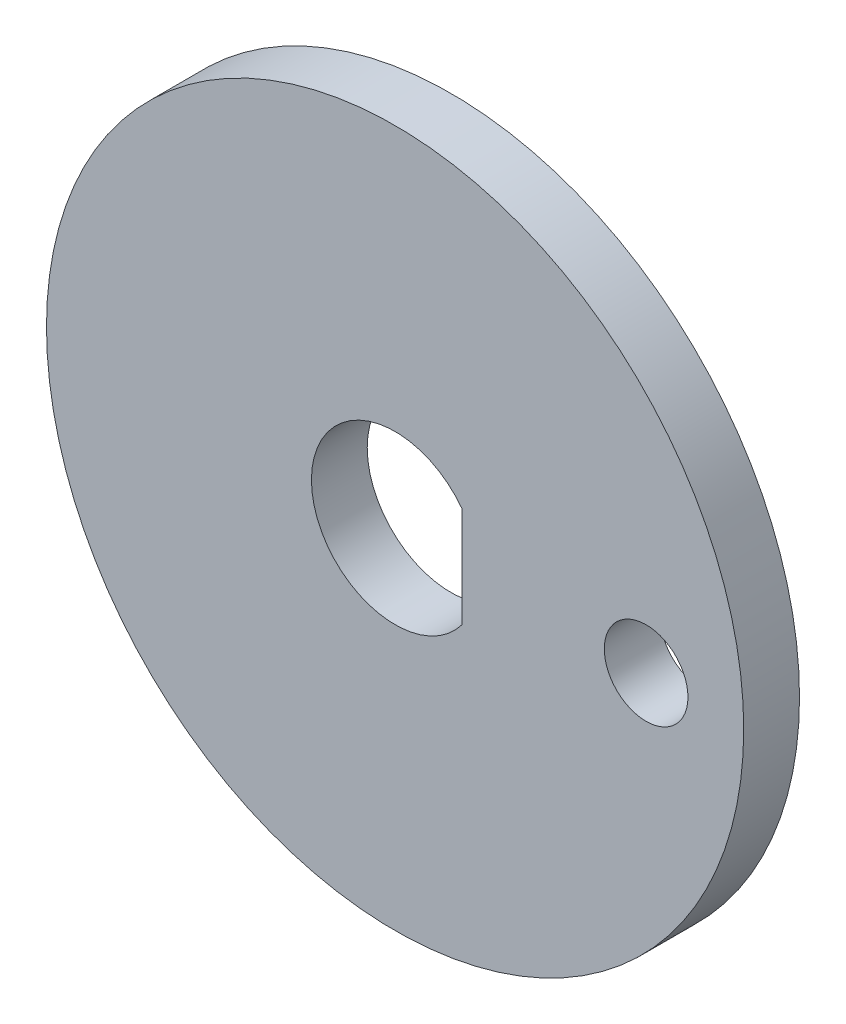
ISO-10303-21;
HEADER;
FILE_DESCRIPTION(('STEP AP214'),'2;1');
FILE_NAME('part.step','',(''),(''),'','','');
FILE_SCHEMA(('AUTOMOTIVE_DESIGN { 1 0 10303 214 1 1 1 1 }'));
ENDSEC;
DATA;
#1=APPLICATION_CONTEXT('core data for automotive mechanical design processes');
#2=APPLICATION_PROTOCOL_DEFINITION('international standard','automotive_design',2000,#1);
#3=PRODUCT_CONTEXT('',#1,'mechanical');
#4=PRODUCT('Part','Part','',(#3));
#5=PRODUCT_RELATED_PRODUCT_CATEGORY('part','',(#4));
#6=PRODUCT_DEFINITION_FORMATION('','',#4);
#7=PRODUCT_DEFINITION_CONTEXT('part definition',#1,'design');
#8=PRODUCT_DEFINITION('design','',#6,#7);
#9=PRODUCT_DEFINITION_SHAPE('','',#8);
#10=(LENGTH_UNIT() NAMED_UNIT(*) SI_UNIT(.MILLI.,.METRE.));
#11=(NAMED_UNIT(*) PLANE_ANGLE_UNIT() SI_UNIT($,.RADIAN.));
#12=(NAMED_UNIT(*) SI_UNIT($,.STERADIAN.) SOLID_ANGLE_UNIT());
#13=UNCERTAINTY_MEASURE_WITH_UNIT(LENGTH_MEASURE(1.E-05),#10,'distance_accuracy_value','');
#14=(GEOMETRIC_REPRESENTATION_CONTEXT(3) GLOBAL_UNCERTAINTY_ASSIGNED_CONTEXT((#13)) GLOBAL_UNIT_ASSIGNED_CONTEXT((#10,
#11,#12)) REPRESENTATION_CONTEXT('',''));
#15=CARTESIAN_POINT('',(0.,0.,0.));
#16=DIRECTION('',(0.,0.,1.));
#17=DIRECTION('',(1.,0.,0.));
#18=AXIS2_PLACEMENT_3D('',#15,#16,#17);
#19=CARTESIAN_POINT('',(6.90000000000001,0.,2.));
#20=DIRECTION('',(0.,0.,1.));
#21=DIRECTION('',(1.,0.,0.));
#22=AXIS2_PLACEMENT_3D('',#19,#20,#21);
#23=PLANE('',#22);
#24=CARTESIAN_POINT('',(6.90000000000001,0.,2.));
#25=DIRECTION('',(0.,0.,1.));
#26=DIRECTION('',(1.,0.,0.));
#27=AXIS2_PLACEMENT_3D('',#24,#25,#26);
#28=CIRCLE('',#27,12.5);
#29=CARTESIAN_POINT('',(19.4,0.,2.));
#30=VERTEX_POINT('',#29);
#31=EDGE_CURVE('E11',#30,#30,#28,.T.);
#32=ORIENTED_EDGE('',*,*,#31,.T.);
#33=EDGE_LOOP('',(#32));
#34=FACE_BOUND('',#33,.T.);
#35=CARTESIAN_POINT('',(15.9,0.,2.));
#36=DIRECTION('',(0.,0.,1.));
#37=DIRECTION('',(1.,0.,0.));
#38=AXIS2_PLACEMENT_3D('',#35,#36,#37);
#39=CIRCLE('',#38,1.5);
#40=CARTESIAN_POINT('',(17.4,0.,2.));
#41=VERTEX_POINT('',#40);
#42=EDGE_CURVE('E79',#41,#41,#39,.T.);
#43=ORIENTED_EDGE('',*,*,#42,.F.);
#44=EDGE_LOOP('',(#43));
#45=FACE_BOUND('',#44,.T.);
#46=DIRECTION('',(0.,1.,0.));
#47=VECTOR('',#46,1.);
#48=CARTESIAN_POINT('',(9.30000000000001,-1.80000000000001,2.));
#49=LINE('',#48,#47);
#50=CARTESIAN_POINT('',(9.30000000000001,-1.80000000000001,2.));
#51=VERTEX_POINT('',#50);
#52=CARTESIAN_POINT('',(9.30000000000001,1.8,2.));
#53=VERTEX_POINT('',#52);
#54=EDGE_CURVE('E75',#51,#53,#49,.T.);
#55=ORIENTED_EDGE('',*,*,#54,.F.);
#56=CARTESIAN_POINT('',(6.90000000000001,0.,2.));
#57=DIRECTION('',(0.,0.,1.));
#58=DIRECTION('',(1.,0.,0.));
#59=AXIS2_PLACEMENT_3D('',#56,#57,#58);
#60=CIRCLE('',#59,3.);
#61=EDGE_CURVE('E65',#53,#51,#60,.T.);
#62=ORIENTED_EDGE('',*,*,#61,.F.);
#63=EDGE_LOOP('',(#55,#62));
#64=FACE_BOUND('',#63,.T.);
#65=ADVANCED_FACE('F33',(#34,#45,#64),#23,.T.);
#66=CARTESIAN_POINT('',(6.90000000000001,0.,0.));
#67=DIRECTION('',(0.,0.,1.));
#68=DIRECTION('',(1.,0.,0.));
#69=AXIS2_PLACEMENT_3D('',#66,#67,#68);
#70=PLANE('',#69);
#71=CARTESIAN_POINT('',(15.9,0.,0.));
#72=DIRECTION('',(0.,0.,1.));
#73=DIRECTION('',(1.,0.,0.));
#74=AXIS2_PLACEMENT_3D('',#71,#72,#73);
#75=CIRCLE('',#74,1.5);
#76=CARTESIAN_POINT('',(17.4,0.,0.));
#77=VERTEX_POINT('',#76);
#78=EDGE_CURVE('E70',#77,#77,#75,.T.);
#79=ORIENTED_EDGE('',*,*,#78,.T.);
#80=EDGE_LOOP('',(#79));
#81=FACE_BOUND('',#80,.T.);
#82=CARTESIAN_POINT('',(6.90000000000001,0.,0.));
#83=DIRECTION('',(0.,0.,1.));
#84=DIRECTION('',(1.,0.,0.));
#85=AXIS2_PLACEMENT_3D('',#82,#83,#84);
#86=CIRCLE('',#85,12.5);
#87=CARTESIAN_POINT('',(19.4,0.,0.));
#88=VERTEX_POINT('',#87);
#89=EDGE_CURVE('E37',#88,#88,#86,.T.);
#90=ORIENTED_EDGE('',*,*,#89,.F.);
#91=EDGE_LOOP('',(#90));
#92=FACE_BOUND('',#91,.T.);
#93=CARTESIAN_POINT('',(6.90000000000001,0.,0.));
#94=DIRECTION('',(0.,0.,1.));
#95=DIRECTION('',(1.,0.,0.));
#96=AXIS2_PLACEMENT_3D('',#93,#94,#95);
#97=CIRCLE('',#96,3.);
#98=CARTESIAN_POINT('',(9.30000000000001,1.8,0.));
#99=VERTEX_POINT('',#98);
#100=CARTESIAN_POINT('',(9.30000000000001,-1.80000000000001,0.));
#101=VERTEX_POINT('',#100);
#102=EDGE_CURVE('E55',#99,#101,#97,.T.);
#103=ORIENTED_EDGE('',*,*,#102,.T.);
#104=DIRECTION('',(0.,1.,0.));
#105=VECTOR('',#104,1.);
#106=CARTESIAN_POINT('',(9.30000000000001,-1.80000000000001,0.));
#107=LINE('',#106,#105);
#108=EDGE_CURVE('E61',#101,#99,#107,.T.);
#109=ORIENTED_EDGE('',*,*,#108,.T.);
#110=EDGE_LOOP('',(#103,#109));
#111=FACE_BOUND('',#110,.T.);
#112=ADVANCED_FACE('F72',(#81,#92,#111),#70,.F.);
#113=CARTESIAN_POINT('',(6.90000000000001,0.,2.));
#114=DIRECTION('',(0.,0.,-1.));
#115=DIRECTION('',(-1.,0.,0.));
#116=AXIS2_PLACEMENT_3D('',#113,#114,#115);
#117=CYLINDRICAL_SURFACE('',#116,12.5);
#118=ORIENTED_EDGE('',*,*,#31,.F.);
#119=EDGE_LOOP('',(#118));
#120=FACE_BOUND('',#119,.T.);
#121=ORIENTED_EDGE('',*,*,#89,.T.);
#122=EDGE_LOOP('',(#121));
#123=FACE_BOUND('',#122,.T.);
#124=ADVANCED_FACE('F35',(#120,#123),#117,.T.);
#125=CARTESIAN_POINT('',(15.9,0.,2.));
#126=DIRECTION('',(0.,0.,-1.));
#127=DIRECTION('',(-1.,0.,0.));
#128=AXIS2_PLACEMENT_3D('',#125,#126,#127);
#129=CYLINDRICAL_SURFACE('',#128,1.5);
#130=ORIENTED_EDGE('',*,*,#42,.T.);
#131=EDGE_LOOP('',(#130));
#132=FACE_BOUND('',#131,.T.);
#133=ORIENTED_EDGE('',*,*,#78,.F.);
#134=EDGE_LOOP('',(#133));
#135=FACE_BOUND('',#134,.T.);
#136=ADVANCED_FACE('F87',(#132,#135),#129,.F.);
#137=CARTESIAN_POINT('',(6.90000000000001,0.,2.));
#138=DIRECTION('',(0.,0.,-1.));
#139=DIRECTION('',(-1.,0.,0.));
#140=AXIS2_PLACEMENT_3D('',#137,#138,#139);
#141=CYLINDRICAL_SURFACE('',#140,3.);
#142=ORIENTED_EDGE('',*,*,#102,.F.);
#143=DIRECTION('',(0.,0.,-1.));
#144=VECTOR('',#143,1.);
#145=CARTESIAN_POINT('',(9.30000000000001,1.8,2.));
#146=LINE('',#145,#144);
#147=EDGE_CURVE('E63',#53,#99,#146,.T.);
#148=ORIENTED_EDGE('',*,*,#147,.F.);
#149=ORIENTED_EDGE('',*,*,#61,.T.);
#150=DIRECTION('',(0.,0.,-1.));
#151=VECTOR('',#150,1.);
#152=CARTESIAN_POINT('',(9.30000000000001,-1.80000000000001,2.));
#153=LINE('',#152,#151);
#154=EDGE_CURVE('E48',#51,#101,#153,.T.);
#155=ORIENTED_EDGE('',*,*,#154,.T.);
#156=EDGE_LOOP('',(#142,#148,#149,#155));
#157=FACE_BOUND('',#156,.T.);
#158=ADVANCED_FACE('F67',(#157),#141,.F.);
#159=CARTESIAN_POINT('',(9.30000000000001,-1.80000000000001,2.));
#160=DIRECTION('',(-1.,0.,0.));
#161=DIRECTION('',(0.,0.,1.));
#162=AXIS2_PLACEMENT_3D('',#159,#160,#161);
#163=PLANE('',#162);
#164=ORIENTED_EDGE('',*,*,#108,.F.);
#165=ORIENTED_EDGE('',*,*,#154,.F.);
#166=ORIENTED_EDGE('',*,*,#54,.T.);
#167=ORIENTED_EDGE('',*,*,#147,.T.);
#168=EDGE_LOOP('',(#164,#165,#166,#167));
#169=FACE_BOUND('',#168,.T.);
#170=ADVANCED_FACE('F62',(#169),#163,.T.);
#171=CLOSED_SHELL('',(#65,#112,#124,#136,#158,#170));
#172=MANIFOLD_SOLID_BREP('B2',#171);
#173=ADVANCED_BREP_SHAPE_REPRESENTATION('',(#18,#172),#14);
#174=SHAPE_DEFINITION_REPRESENTATION(#9,#173);
ENDSEC;
END-ISO-10303-21;
